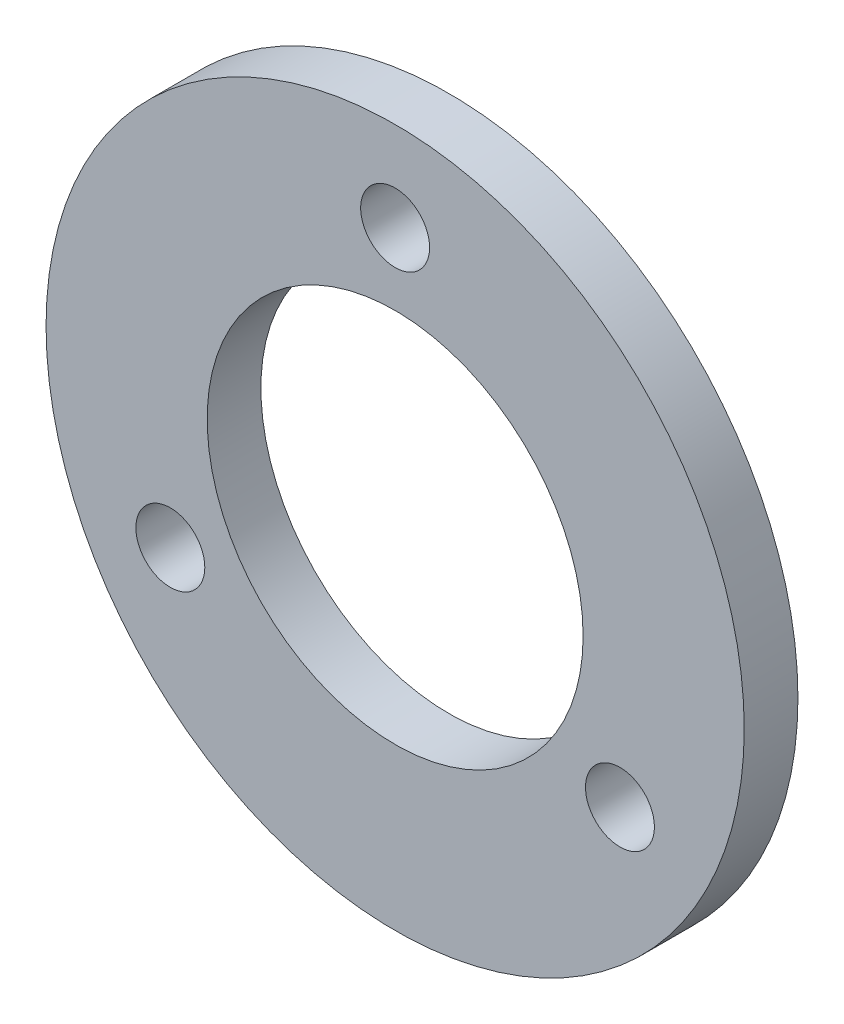
ISO-10303-21;
HEADER;
FILE_DESCRIPTION(('STEP AP214'),'2;1');
FILE_NAME('part.step','',(''),(''),'','','');
FILE_SCHEMA(('AUTOMOTIVE_DESIGN { 1 0 10303 214 1 1 1 1 }'));
ENDSEC;
DATA;
#1=APPLICATION_CONTEXT('core data for automotive mechanical design processes');
#2=APPLICATION_PROTOCOL_DEFINITION('international standard','automotive_design',2000,#1);
#3=PRODUCT_CONTEXT('',#1,'mechanical');
#4=PRODUCT('Part','Part','',(#3));
#5=PRODUCT_RELATED_PRODUCT_CATEGORY('part','',(#4));
#6=PRODUCT_DEFINITION_FORMATION('','',#4);
#7=PRODUCT_DEFINITION_CONTEXT('part definition',#1,'design');
#8=PRODUCT_DEFINITION('design','',#6,#7);
#9=PRODUCT_DEFINITION_SHAPE('','',#8);
#10=(LENGTH_UNIT() NAMED_UNIT(*) SI_UNIT(.MILLI.,.METRE.));
#11=(NAMED_UNIT(*) PLANE_ANGLE_UNIT() SI_UNIT($,.RADIAN.));
#12=(NAMED_UNIT(*) SI_UNIT($,.STERADIAN.) SOLID_ANGLE_UNIT());
#13=UNCERTAINTY_MEASURE_WITH_UNIT(LENGTH_MEASURE(1.E-05),#10,'distance_accuracy_value','');
#14=(GEOMETRIC_REPRESENTATION_CONTEXT(3) GLOBAL_UNCERTAINTY_ASSIGNED_CONTEXT((#13)) GLOBAL_UNIT_ASSIGNED_CONTEXT((#10,
#11,#12)) REPRESENTATION_CONTEXT('',''));
#15=CARTESIAN_POINT('',(0.,0.,0.));
#16=DIRECTION('',(0.,0.,1.));
#17=DIRECTION('',(1.,0.,0.));
#18=AXIS2_PLACEMENT_3D('',#15,#16,#17);
#19=CARTESIAN_POINT('',(-3.2263081095607E-10,1.58206781009085E-10,3.));
#20=DIRECTION('',(0.,0.,1.));
#21=DIRECTION('',(1.,0.,0.));
#22=AXIS2_PLACEMENT_3D('',#19,#20,#21);
#23=PLANE('',#22);
#24=CARTESIAN_POINT('',(-12.5573683548491,-7.25000000035903,3.));
#25=DIRECTION('',(0.,0.,1.));
#26=DIRECTION('',(1.,0.,0.));
#27=AXIS2_PLACEMENT_3D('',#24,#25,#26);
#28=CIRCLE('',#27,1.92500000000102);
#29=CARTESIAN_POINT('',(-10.6323683548481,-7.25000000035903,3.));
#30=VERTEX_POINT('',#29);
#31=EDGE_CURVE('E52',#30,#30,#28,.T.);
#32=ORIENTED_EDGE('',*,*,#31,.F.);
#33=EDGE_LOOP('',(#32));
#34=FACE_BOUND('',#33,.T.);
#35=CARTESIAN_POINT('',(-3.2263081095607E-10,1.58206781009085E-10,3.));
#36=DIRECTION('',(0.,0.,1.));
#37=DIRECTION('',(1.,0.,0.));
#38=AXIS2_PLACEMENT_3D('',#35,#36,#37);
#39=CIRCLE('',#38,10.5);
#40=CARTESIAN_POINT('',(10.4999999996773,1.58206781009085E-10,3.));
#41=VERTEX_POINT('',#40);
#42=EDGE_CURVE('E41',#41,#41,#39,.T.);
#43=ORIENTED_EDGE('',*,*,#42,.F.);
#44=EDGE_LOOP('',(#43));
#45=FACE_BOUND('',#44,.T.);
#46=CARTESIAN_POINT('',(-3.2263081095607E-10,1.58206781009085E-10,3.));
#47=DIRECTION('',(0.,0.,1.));
#48=DIRECTION('',(1.,0.,0.));
#49=AXIS2_PLACEMENT_3D('',#46,#47,#48);
#50=CIRCLE('',#49,19.5);
#51=CARTESIAN_POINT('',(19.4999999996774,1.58206781009085E-10,3.));
#52=VERTEX_POINT('',#51);
#53=EDGE_CURVE('E10',#52,#52,#50,.T.);
#54=ORIENTED_EDGE('',*,*,#53,.T.);
#55=EDGE_LOOP('',(#54));
#56=FACE_BOUND('',#55,.T.);
#57=CARTESIAN_POINT('',(12.5573683551736,-7.24999999979914,3.));
#58=DIRECTION('',(0.,0.,1.));
#59=DIRECTION('',(1.,0.,0.));
#60=AXIS2_PLACEMENT_3D('',#57,#58,#59);
#61=CIRCLE('',#60,1.92500000000096);
#62=CARTESIAN_POINT('',(14.4823683551745,-7.24999999979914,3.));
#63=VERTEX_POINT('',#62);
#64=EDGE_CURVE('E46',#63,#63,#61,.T.);
#65=ORIENTED_EDGE('',*,*,#64,.F.);
#66=EDGE_LOOP('',(#65));
#67=FACE_BOUND('',#66,.T.);
#68=CARTESIAN_POINT('',(-3.2263081095607E-10,14.5000000001582,3.));
#69=DIRECTION('',(0.,0.,1.));
#70=DIRECTION('',(1.,0.,0.));
#71=AXIS2_PLACEMENT_3D('',#68,#69,#70);
#72=CIRCLE('',#71,1.92499999999995);
#73=CARTESIAN_POINT('',(1.92499999967732,14.5000000001582,3.));
#74=VERTEX_POINT('',#73);
#75=EDGE_CURVE('E58',#74,#74,#72,.T.);
#76=ORIENTED_EDGE('',*,*,#75,.F.);
#77=EDGE_LOOP('',(#76));
#78=FACE_BOUND('',#77,.T.);
#79=ADVANCED_FACE('F30',(#34,#45,#56,#67,#78),#23,.T.);
#80=CARTESIAN_POINT('',(-3.2263081095607E-10,1.58206781009085E-10,0.));
#81=DIRECTION('',(0.,0.,1.));
#82=DIRECTION('',(1.,0.,0.));
#83=AXIS2_PLACEMENT_3D('',#80,#81,#82);
#84=PLANE('',#83);
#85=CARTESIAN_POINT('',(-3.2263081095607E-10,1.58206781009085E-10,0.));
#86=DIRECTION('',(0.,0.,1.));
#87=DIRECTION('',(1.,0.,0.));
#88=AXIS2_PLACEMENT_3D('',#85,#86,#87);
#89=CIRCLE('',#88,19.5);
#90=CARTESIAN_POINT('',(19.4999999996774,1.58206781009085E-10,0.));
#91=VERTEX_POINT('',#90);
#92=EDGE_CURVE('E34',#91,#91,#89,.T.);
#93=ORIENTED_EDGE('',*,*,#92,.F.);
#94=EDGE_LOOP('',(#93));
#95=FACE_BOUND('',#94,.T.);
#96=CARTESIAN_POINT('',(-3.2263081095607E-10,1.58206781009085E-10,0.));
#97=DIRECTION('',(0.,0.,1.));
#98=DIRECTION('',(1.,0.,0.));
#99=AXIS2_PLACEMENT_3D('',#96,#97,#98);
#100=CIRCLE('',#99,10.5);
#101=CARTESIAN_POINT('',(10.4999999996773,1.58206781009085E-10,0.));
#102=VERTEX_POINT('',#101);
#103=EDGE_CURVE('E43',#102,#102,#100,.T.);
#104=ORIENTED_EDGE('',*,*,#103,.T.);
#105=EDGE_LOOP('',(#104));
#106=FACE_BOUND('',#105,.T.);
#107=CARTESIAN_POINT('',(12.5573683551736,-7.24999999979914,0.));
#108=DIRECTION('',(0.,0.,1.));
#109=DIRECTION('',(1.,0.,0.));
#110=AXIS2_PLACEMENT_3D('',#107,#108,#109);
#111=CIRCLE('',#110,1.92500000000096);
#112=CARTESIAN_POINT('',(14.4823683551745,-7.24999999979914,0.));
#113=VERTEX_POINT('',#112);
#114=EDGE_CURVE('E49',#113,#113,#111,.T.);
#115=ORIENTED_EDGE('',*,*,#114,.T.);
#116=EDGE_LOOP('',(#115));
#117=FACE_BOUND('',#116,.T.);
#118=CARTESIAN_POINT('',(-12.5573683548491,-7.25000000035903,0.));
#119=DIRECTION('',(0.,0.,1.));
#120=DIRECTION('',(1.,0.,0.));
#121=AXIS2_PLACEMENT_3D('',#118,#119,#120);
#122=CIRCLE('',#121,1.92500000000102);
#123=CARTESIAN_POINT('',(-10.6323683548481,-7.25000000035903,0.));
#124=VERTEX_POINT('',#123);
#125=EDGE_CURVE('E55',#124,#124,#122,.T.);
#126=ORIENTED_EDGE('',*,*,#125,.T.);
#127=EDGE_LOOP('',(#126));
#128=FACE_BOUND('',#127,.T.);
#129=CARTESIAN_POINT('',(-3.2263081095607E-10,14.5000000001582,0.));
#130=DIRECTION('',(0.,0.,1.));
#131=DIRECTION('',(1.,0.,0.));
#132=AXIS2_PLACEMENT_3D('',#129,#130,#131);
#133=CIRCLE('',#132,1.92499999999995);
#134=CARTESIAN_POINT('',(1.92499999967732,14.5000000001582,0.));
#135=VERTEX_POINT('',#134);
#136=EDGE_CURVE('E61',#135,#135,#133,.T.);
#137=ORIENTED_EDGE('',*,*,#136,.T.);
#138=EDGE_LOOP('',(#137));
#139=FACE_BOUND('',#138,.T.);
#140=ADVANCED_FACE('F71',(#95,#106,#117,#128,#139),#84,.F.);
#141=CARTESIAN_POINT('',(-3.2263081095607E-10,1.58206781009085E-10,3.));
#142=DIRECTION('',(0.,0.,-1.));
#143=DIRECTION('',(-1.,0.,0.));
#144=AXIS2_PLACEMENT_3D('',#141,#142,#143);
#145=CYLINDRICAL_SURFACE('',#144,19.5);
#146=ORIENTED_EDGE('',*,*,#53,.F.);
#147=EDGE_LOOP('',(#146));
#148=FACE_BOUND('',#147,.T.);
#149=ORIENTED_EDGE('',*,*,#92,.T.);
#150=EDGE_LOOP('',(#149));
#151=FACE_BOUND('',#150,.T.);
#152=ADVANCED_FACE('F32',(#148,#151),#145,.T.);
#153=CARTESIAN_POINT('',(-3.2263081095607E-10,1.58206781009085E-10,3.));
#154=DIRECTION('',(0.,0.,-1.));
#155=DIRECTION('',(-1.,0.,0.));
#156=AXIS2_PLACEMENT_3D('',#153,#154,#155);
#157=CYLINDRICAL_SURFACE('',#156,10.5);
#158=ORIENTED_EDGE('',*,*,#42,.T.);
#159=EDGE_LOOP('',(#158));
#160=FACE_BOUND('',#159,.T.);
#161=ORIENTED_EDGE('',*,*,#103,.F.);
#162=EDGE_LOOP('',(#161));
#163=FACE_BOUND('',#162,.T.);
#164=ADVANCED_FACE('F81',(#160,#163),#157,.F.);
#165=CARTESIAN_POINT('',(12.5573683551736,-7.24999999979914,3.));
#166=DIRECTION('',(0.,0.,-1.));
#167=DIRECTION('',(-1.,0.,0.));
#168=AXIS2_PLACEMENT_3D('',#165,#166,#167);
#169=CYLINDRICAL_SURFACE('',#168,1.92500000000096);
#170=ORIENTED_EDGE('',*,*,#64,.T.);
#171=EDGE_LOOP('',(#170));
#172=FACE_BOUND('',#171,.T.);
#173=ORIENTED_EDGE('',*,*,#114,.F.);
#174=EDGE_LOOP('',(#173));
#175=FACE_BOUND('',#174,.T.);
#176=ADVANCED_FACE('F84',(#172,#175),#169,.F.);
#177=CARTESIAN_POINT('',(-12.5573683548491,-7.25000000035903,3.));
#178=DIRECTION('',(0.,0.,-1.));
#179=DIRECTION('',(-1.,0.,0.));
#180=AXIS2_PLACEMENT_3D('',#177,#178,#179);
#181=CYLINDRICAL_SURFACE('',#180,1.92500000000102);
#182=ORIENTED_EDGE('',*,*,#31,.T.);
#183=EDGE_LOOP('',(#182));
#184=FACE_BOUND('',#183,.T.);
#185=ORIENTED_EDGE('',*,*,#125,.F.);
#186=EDGE_LOOP('',(#185));
#187=FACE_BOUND('',#186,.T.);
#188=ADVANCED_FACE('F88',(#184,#187),#181,.F.);
#189=CARTESIAN_POINT('',(-3.2263081095607E-10,14.5000000001582,3.));
#190=DIRECTION('',(0.,0.,-1.));
#191=DIRECTION('',(-1.,0.,0.));
#192=AXIS2_PLACEMENT_3D('',#189,#190,#191);
#193=CYLINDRICAL_SURFACE('',#192,1.92499999999995);
#194=ORIENTED_EDGE('',*,*,#75,.T.);
#195=EDGE_LOOP('',(#194));
#196=FACE_BOUND('',#195,.T.);
#197=ORIENTED_EDGE('',*,*,#136,.F.);
#198=EDGE_LOOP('',(#197));
#199=FACE_BOUND('',#198,.T.);
#200=ADVANCED_FACE('F67',(#196,#199),#193,.F.);
#201=CLOSED_SHELL('',(#79,#140,#152,#164,#176,#188,#200));
#202=MANIFOLD_SOLID_BREP('B2',#201);
#203=ADVANCED_BREP_SHAPE_REPRESENTATION('',(#18,#202),#14);
#204=SHAPE_DEFINITION_REPRESENTATION(#9,#203);
ENDSEC;
END-ISO-10303-21;
